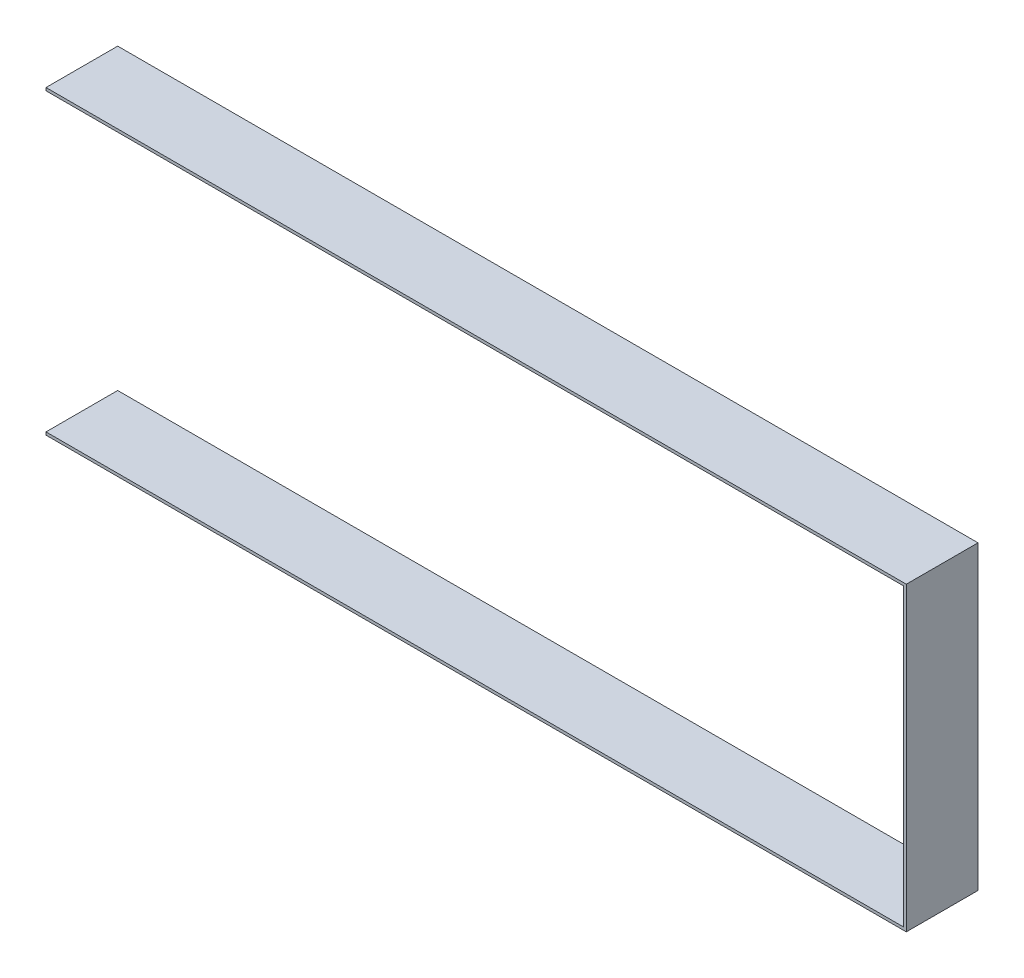
ISO-10303-21;
HEADER;
FILE_DESCRIPTION(('STEP AP214'),'2;1');
FILE_NAME('part.step','',(''),(''),'','','');
FILE_SCHEMA(('AUTOMOTIVE_DESIGN { 1 0 10303 214 1 1 1 1 }'));
ENDSEC;
DATA;
#1=APPLICATION_CONTEXT('core data for automotive mechanical design processes');
#2=APPLICATION_PROTOCOL_DEFINITION('international standard','automotive_design',2000,#1);
#3=PRODUCT_CONTEXT('',#1,'mechanical');
#4=PRODUCT('Part','Part','',(#3));
#5=PRODUCT_RELATED_PRODUCT_CATEGORY('part','',(#4));
#6=PRODUCT_DEFINITION_FORMATION('','',#4);
#7=PRODUCT_DEFINITION_CONTEXT('part definition',#1,'design');
#8=PRODUCT_DEFINITION('design','',#6,#7);
#9=PRODUCT_DEFINITION_SHAPE('','',#8);
#10=(LENGTH_UNIT() NAMED_UNIT(*) SI_UNIT(.MILLI.,.METRE.));
#11=(NAMED_UNIT(*) PLANE_ANGLE_UNIT() SI_UNIT($,.RADIAN.));
#12=(NAMED_UNIT(*) SI_UNIT($,.STERADIAN.) SOLID_ANGLE_UNIT());
#13=UNCERTAINTY_MEASURE_WITH_UNIT(LENGTH_MEASURE(1.E-05),#10,'distance_accuracy_value','');
#14=(GEOMETRIC_REPRESENTATION_CONTEXT(3) GLOBAL_UNCERTAINTY_ASSIGNED_CONTEXT((#13)) GLOBAL_UNIT_ASSIGNED_CONTEXT((#10,
#11,#12)) REPRESENTATION_CONTEXT('',''));
#15=CARTESIAN_POINT('',(0.,0.,0.));
#16=DIRECTION('',(0.,0.,1.));
#17=DIRECTION('',(1.,0.,0.));
#18=AXIS2_PLACEMENT_3D('',#15,#16,#17);
#19=CARTESIAN_POINT('',(-2.07433333333334,0.254,6.35));
#20=DIRECTION('',(1.,0.,0.));
#21=DIRECTION('',(0.,0.,-1.));
#22=AXIS2_PLACEMENT_3D('',#19,#20,#21);
#23=PLANE('',#22);
#24=DIRECTION('',(0.,-1.,0.));
#25=VECTOR('',#24,1.);
#26=CARTESIAN_POINT('',(-2.07433333333334,0.254,0.));
#27=LINE('',#26,#25);
#28=CARTESIAN_POINT('',(-2.07433333333334,0.254,0.));
#29=VERTEX_POINT('',#28);
#30=CARTESIAN_POINT('',(-2.07433333333334,0.,0.));
#31=VERTEX_POINT('',#30);
#32=EDGE_CURVE('E129',#29,#31,#27,.T.);
#33=ORIENTED_EDGE('',*,*,#32,.T.);
#34=DIRECTION('',(0.,0.,-1.));
#35=VECTOR('',#34,1.);
#36=CARTESIAN_POINT('',(-2.07433333333334,0.,6.35));
#37=LINE('',#36,#35);
#38=CARTESIAN_POINT('',(-2.07433333333334,0.,6.35));
#39=VERTEX_POINT('',#38);
#40=EDGE_CURVE('E11',#39,#31,#37,.T.);
#41=ORIENTED_EDGE('',*,*,#40,.F.);
#42=DIRECTION('',(0.,-1.,0.));
#43=VECTOR('',#42,1.);
#44=CARTESIAN_POINT('',(-2.07433333333334,0.254,6.35));
#45=LINE('',#44,#43);
#46=CARTESIAN_POINT('',(-2.07433333333334,0.254,6.35));
#47=VERTEX_POINT('',#46);
#48=EDGE_CURVE('E143',#47,#39,#45,.T.);
#49=ORIENTED_EDGE('',*,*,#48,.F.);
#50=DIRECTION('',(0.,0.,-1.));
#51=VECTOR('',#50,1.);
#52=CARTESIAN_POINT('',(-2.07433333333334,0.254,6.35));
#53=LINE('',#52,#51);
#54=EDGE_CURVE('E125',#47,#29,#53,.T.);
#55=ORIENTED_EDGE('',*,*,#54,.T.);
#56=EDGE_LOOP('',(#33,#41,#49,#55));
#57=FACE_BOUND('',#56,.T.);
#58=ADVANCED_FACE('F33',(#57),#23,.F.);
#59=CARTESIAN_POINT('',(-2.07433333333334,0.,6.35));
#60=DIRECTION('',(0.,1.,0.));
#61=DIRECTION('',(0.,0.,1.));
#62=AXIS2_PLACEMENT_3D('',#59,#60,#61);
#63=PLANE('',#62);
#64=DIRECTION('',(1.,0.,0.));
#65=VECTOR('',#64,1.);
#66=CARTESIAN_POINT('',(-2.07433333333334,0.,0.));
#67=LINE('',#66,#65);
#68=CARTESIAN_POINT('',(74.1256666666667,0.,0.));
#69=VERTEX_POINT('',#68);
#70=EDGE_CURVE('E132',#31,#69,#67,.T.);
#71=ORIENTED_EDGE('',*,*,#70,.T.);
#72=DIRECTION('',(0.,0.,-1.));
#73=VECTOR('',#72,1.);
#74=CARTESIAN_POINT('',(74.1256666666667,0.,6.35));
#75=LINE('',#74,#73);
#76=CARTESIAN_POINT('',(74.1256666666667,0.,6.35));
#77=VERTEX_POINT('',#76);
#78=EDGE_CURVE('E41',#77,#69,#75,.T.);
#79=ORIENTED_EDGE('',*,*,#78,.F.);
#80=DIRECTION('',(1.,0.,0.));
#81=VECTOR('',#80,1.);
#82=CARTESIAN_POINT('',(-2.07433333333334,0.,6.35));
#83=LINE('',#82,#81);
#84=EDGE_CURVE('E92',#39,#77,#83,.T.);
#85=ORIENTED_EDGE('',*,*,#84,.F.);
#86=ORIENTED_EDGE('',*,*,#40,.T.);
#87=EDGE_LOOP('',(#71,#79,#85,#86));
#88=FACE_BOUND('',#87,.T.);
#89=ADVANCED_FACE('F178',(#88),#63,.F.);
#90=CARTESIAN_POINT('',(74.1256666666667,0.,6.35));
#91=DIRECTION('',(-1.,0.,0.));
#92=DIRECTION('',(0.,0.,1.));
#93=AXIS2_PLACEMENT_3D('',#90,#91,#92);
#94=PLANE('',#93);
#95=DIRECTION('',(0.,1.,0.));
#96=VECTOR('',#95,1.);
#97=CARTESIAN_POINT('',(74.1256666666667,0.,0.));
#98=LINE('',#97,#96);
#99=CARTESIAN_POINT('',(74.1256666666667,26.67,0.));
#100=VERTEX_POINT('',#99);
#101=EDGE_CURVE('E134',#69,#100,#98,.T.);
#102=ORIENTED_EDGE('',*,*,#101,.T.);
#103=DIRECTION('',(0.,0.,-1.));
#104=VECTOR('',#103,1.);
#105=CARTESIAN_POINT('',(74.1256666666667,26.67,6.35));
#106=LINE('',#105,#104);
#107=CARTESIAN_POINT('',(74.1256666666667,26.67,6.35));
#108=VERTEX_POINT('',#107);
#109=EDGE_CURVE('E150',#108,#100,#106,.T.);
#110=ORIENTED_EDGE('',*,*,#109,.F.);
#111=DIRECTION('',(0.,1.,0.));
#112=VECTOR('',#111,1.);
#113=CARTESIAN_POINT('',(74.1256666666667,0.,6.35));
#114=LINE('',#113,#112);
#115=EDGE_CURVE('E158',#77,#108,#114,.T.);
#116=ORIENTED_EDGE('',*,*,#115,.F.);
#117=ORIENTED_EDGE('',*,*,#78,.T.);
#118=EDGE_LOOP('',(#102,#110,#116,#117));
#119=FACE_BOUND('',#118,.T.);
#120=ADVANCED_FACE('F156',(#119),#94,.F.);
#121=CARTESIAN_POINT('',(74.1256666666667,26.67,6.35));
#122=DIRECTION('',(0.,-1.,0.));
#123=DIRECTION('',(1.,0.,0.));
#124=AXIS2_PLACEMENT_3D('',#121,#122,#123);
#125=PLANE('',#124);
#126=DIRECTION('',(-1.,0.,0.));
#127=VECTOR('',#126,1.);
#128=CARTESIAN_POINT('',(74.1256666666667,26.67,0.));
#129=LINE('',#128,#127);
#130=CARTESIAN_POINT('',(-2.07433333333333,26.67,0.));
#131=VERTEX_POINT('',#130);
#132=EDGE_CURVE('E136',#100,#131,#129,.T.);
#133=ORIENTED_EDGE('',*,*,#132,.T.);
#134=DIRECTION('',(0.,0.,-1.));
#135=VECTOR('',#134,1.);
#136=CARTESIAN_POINT('',(-2.07433333333333,26.67,6.35));
#137=LINE('',#136,#135);
#138=CARTESIAN_POINT('',(-2.07433333333333,26.67,6.35));
#139=VERTEX_POINT('',#138);
#140=EDGE_CURVE('E147',#139,#131,#137,.T.);
#141=ORIENTED_EDGE('',*,*,#140,.F.);
#142=DIRECTION('',(-1.,0.,0.));
#143=VECTOR('',#142,1.);
#144=CARTESIAN_POINT('',(74.1256666666667,26.67,6.35));
#145=LINE('',#144,#143);
#146=EDGE_CURVE('E170',#108,#139,#145,.T.);
#147=ORIENTED_EDGE('',*,*,#146,.F.);
#148=ORIENTED_EDGE('',*,*,#109,.T.);
#149=EDGE_LOOP('',(#133,#141,#147,#148));
#150=FACE_BOUND('',#149,.T.);
#151=ADVANCED_FACE('F166',(#150),#125,.F.);
#152=CARTESIAN_POINT('',(-2.07433333333333,26.67,6.35));
#153=DIRECTION('',(1.,0.,0.));
#154=DIRECTION('',(0.,0.,-1.));
#155=AXIS2_PLACEMENT_3D('',#152,#153,#154);
#156=PLANE('',#155);
#157=DIRECTION('',(0.,-1.,0.));
#158=VECTOR('',#157,1.);
#159=CARTESIAN_POINT('',(-2.07433333333333,26.67,0.));
#160=LINE('',#159,#158);
#161=CARTESIAN_POINT('',(-2.07433333333333,26.416,0.));
#162=VERTEX_POINT('',#161);
#163=EDGE_CURVE('E138',#131,#162,#160,.T.);
#164=ORIENTED_EDGE('',*,*,#163,.T.);
#165=DIRECTION('',(0.,0.,-1.));
#166=VECTOR('',#165,1.);
#167=CARTESIAN_POINT('',(-2.07433333333333,26.416,6.35));
#168=LINE('',#167,#166);
#169=CARTESIAN_POINT('',(-2.07433333333333,26.416,6.35));
#170=VERTEX_POINT('',#169);
#171=EDGE_CURVE('E120',#170,#162,#168,.T.);
#172=ORIENTED_EDGE('',*,*,#171,.F.);
#173=DIRECTION('',(0.,-1.,0.));
#174=VECTOR('',#173,1.);
#175=CARTESIAN_POINT('',(-2.07433333333333,26.67,6.35));
#176=LINE('',#175,#174);
#177=EDGE_CURVE('E111',#139,#170,#176,.T.);
#178=ORIENTED_EDGE('',*,*,#177,.F.);
#179=ORIENTED_EDGE('',*,*,#140,.T.);
#180=EDGE_LOOP('',(#164,#172,#178,#179));
#181=FACE_BOUND('',#180,.T.);
#182=ADVANCED_FACE('F169',(#181),#156,.F.);
#183=CARTESIAN_POINT('',(-2.07433333333333,26.416,6.35));
#184=DIRECTION('',(0.,1.,0.));
#185=DIRECTION('',(0.,0.,1.));
#186=AXIS2_PLACEMENT_3D('',#183,#184,#185);
#187=PLANE('',#186);
#188=DIRECTION('',(1.,0.,0.));
#189=VECTOR('',#188,1.);
#190=CARTESIAN_POINT('',(-2.07433333333333,26.416,0.));
#191=LINE('',#190,#189);
#192=CARTESIAN_POINT('',(73.8716666666667,26.416,0.));
#193=VERTEX_POINT('',#192);
#194=EDGE_CURVE('E119',#162,#193,#191,.T.);
#195=ORIENTED_EDGE('',*,*,#194,.T.);
#196=DIRECTION('',(0.,0.,-1.));
#197=VECTOR('',#196,1.);
#198=CARTESIAN_POINT('',(73.8716666666667,26.416,6.35));
#199=LINE('',#198,#197);
#200=CARTESIAN_POINT('',(73.8716666666667,26.416,6.35));
#201=VERTEX_POINT('',#200);
#202=EDGE_CURVE('E116',#201,#193,#199,.T.);
#203=ORIENTED_EDGE('',*,*,#202,.F.);
#204=DIRECTION('',(1.,0.,0.));
#205=VECTOR('',#204,1.);
#206=CARTESIAN_POINT('',(-2.07433333333333,26.416,6.35));
#207=LINE('',#206,#205);
#208=EDGE_CURVE('E105',#170,#201,#207,.T.);
#209=ORIENTED_EDGE('',*,*,#208,.F.);
#210=ORIENTED_EDGE('',*,*,#171,.T.);
#211=EDGE_LOOP('',(#195,#203,#209,#210));
#212=FACE_BOUND('',#211,.T.);
#213=ADVANCED_FACE('F117',(#212),#187,.F.);
#214=CARTESIAN_POINT('',(73.8716666666667,26.416,6.35));
#215=DIRECTION('',(1.,0.,0.));
#216=DIRECTION('',(0.,0.,-1.));
#217=AXIS2_PLACEMENT_3D('',#214,#215,#216);
#218=PLANE('',#217);
#219=DIRECTION('',(0.,-1.,0.));
#220=VECTOR('',#219,1.);
#221=CARTESIAN_POINT('',(73.8716666666667,26.416,0.));
#222=LINE('',#221,#220);
#223=CARTESIAN_POINT('',(73.8716666666667,0.254000000000009,0.));
#224=VERTEX_POINT('',#223);
#225=EDGE_CURVE('E78',#193,#224,#222,.T.);
#226=ORIENTED_EDGE('',*,*,#225,.T.);
#227=DIRECTION('',(0.,0.,-1.));
#228=VECTOR('',#227,1.);
#229=CARTESIAN_POINT('',(73.8716666666667,0.254000000000009,6.35));
#230=LINE('',#229,#228);
#231=CARTESIAN_POINT('',(73.8716666666667,0.254000000000009,6.35));
#232=VERTEX_POINT('',#231);
#233=EDGE_CURVE('E121',#232,#224,#230,.T.);
#234=ORIENTED_EDGE('',*,*,#233,.F.);
#235=DIRECTION('',(0.,-1.,0.));
#236=VECTOR('',#235,1.);
#237=CARTESIAN_POINT('',(73.8716666666667,26.416,6.35));
#238=LINE('',#237,#236);
#239=EDGE_CURVE('E109',#201,#232,#238,.T.);
#240=ORIENTED_EDGE('',*,*,#239,.F.);
#241=ORIENTED_EDGE('',*,*,#202,.T.);
#242=EDGE_LOOP('',(#226,#234,#240,#241));
#243=FACE_BOUND('',#242,.T.);
#244=ADVANCED_FACE('F123',(#243),#218,.F.);
#245=CARTESIAN_POINT('',(73.8716666666667,0.254000000000009,6.35));
#246=DIRECTION('',(0.,-1.,0.));
#247=DIRECTION('',(1.,0.,0.));
#248=AXIS2_PLACEMENT_3D('',#245,#246,#247);
#249=PLANE('',#248);
#250=DIRECTION('',(-1.,0.,0.));
#251=VECTOR('',#250,1.);
#252=CARTESIAN_POINT('',(73.8716666666667,0.254000000000009,0.));
#253=LINE('',#252,#251);
#254=EDGE_CURVE('E84',#224,#29,#253,.T.);
#255=ORIENTED_EDGE('',*,*,#254,.T.);
#256=ORIENTED_EDGE('',*,*,#54,.F.);
#257=DIRECTION('',(-1.,0.,0.));
#258=VECTOR('',#257,1.);
#259=CARTESIAN_POINT('',(73.8716666666667,0.254000000000009,6.35));
#260=LINE('',#259,#258);
#261=EDGE_CURVE('E49',#232,#47,#260,.T.);
#262=ORIENTED_EDGE('',*,*,#261,.F.);
#263=ORIENTED_EDGE('',*,*,#233,.T.);
#264=EDGE_LOOP('',(#255,#256,#262,#263));
#265=FACE_BOUND('',#264,.T.);
#266=ADVANCED_FACE('F194',(#265),#249,.F.);
#267=CARTESIAN_POINT('',(0.,0.,6.35));
#268=DIRECTION('',(0.,0.,1.));
#269=DIRECTION('',(1.,0.,0.));
#270=AXIS2_PLACEMENT_3D('',#267,#268,#269);
#271=PLANE('',#270);
#272=ORIENTED_EDGE('',*,*,#48,.T.);
#273=ORIENTED_EDGE('',*,*,#84,.T.);
#274=ORIENTED_EDGE('',*,*,#115,.T.);
#275=ORIENTED_EDGE('',*,*,#146,.T.);
#276=ORIENTED_EDGE('',*,*,#177,.T.);
#277=ORIENTED_EDGE('',*,*,#208,.T.);
#278=ORIENTED_EDGE('',*,*,#239,.T.);
#279=ORIENTED_EDGE('',*,*,#261,.T.);
#280=EDGE_LOOP('',(#272,#273,#274,#275,#276,#277,#278,#279));
#281=FACE_BOUND('',#280,.T.);
#282=ADVANCED_FACE('F107',(#281),#271,.T.);
#283=CARTESIAN_POINT('',(0.,0.,0.));
#284=DIRECTION('',(0.,0.,1.));
#285=DIRECTION('',(1.,0.,0.));
#286=AXIS2_PLACEMENT_3D('',#283,#284,#285);
#287=PLANE('',#286);
#288=ORIENTED_EDGE('',*,*,#32,.F.);
#289=ORIENTED_EDGE('',*,*,#254,.F.);
#290=ORIENTED_EDGE('',*,*,#225,.F.);
#291=ORIENTED_EDGE('',*,*,#194,.F.);
#292=ORIENTED_EDGE('',*,*,#163,.F.);
#293=ORIENTED_EDGE('',*,*,#132,.F.);
#294=ORIENTED_EDGE('',*,*,#101,.F.);
#295=ORIENTED_EDGE('',*,*,#70,.F.);
#296=EDGE_LOOP('',(#288,#289,#290,#291,#292,#293,#294,#295));
#297=FACE_BOUND('',#296,.T.);
#298=ADVANCED_FACE('F162',(#297),#287,.F.);
#299=CLOSED_SHELL('',(#58,#89,#120,#151,#182,#213,#244,#266,#282,#298));
#300=MANIFOLD_SOLID_BREP('B2',#299);
#301=ADVANCED_BREP_SHAPE_REPRESENTATION('',(#18,#300),#14);
#302=SHAPE_DEFINITION_REPRESENTATION(#9,#301);
ENDSEC;
END-ISO-10303-21;
